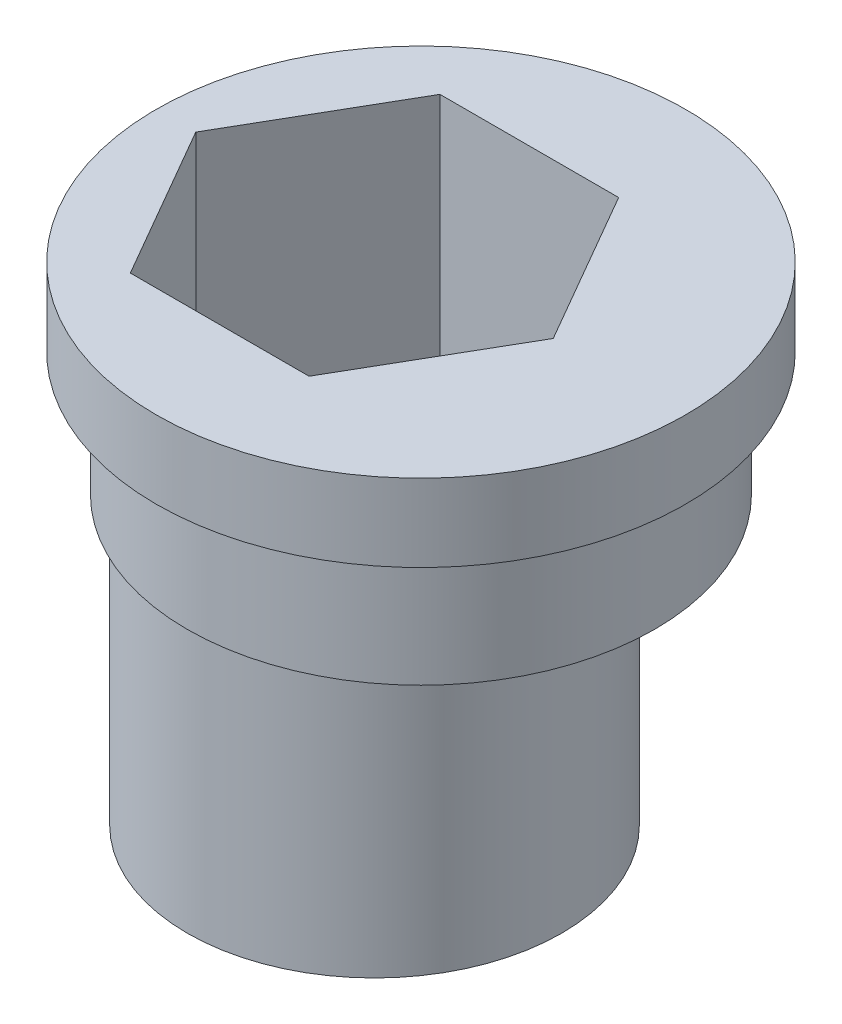
ISO-10303-21;
HEADER;
FILE_DESCRIPTION(('STEP AP214'),'2;1');
FILE_NAME('part.step','',(''),(''),'','','');
FILE_SCHEMA(('AUTOMOTIVE_DESIGN { 1 0 10303 214 1 1 1 1 }'));
ENDSEC;
DATA;
#1=APPLICATION_CONTEXT('core data for automotive mechanical design processes');
#2=APPLICATION_PROTOCOL_DEFINITION('international standard','automotive_design',2000,#1);
#3=PRODUCT_CONTEXT('',#1,'mechanical');
#4=PRODUCT('Part','Part','',(#3));
#5=PRODUCT_RELATED_PRODUCT_CATEGORY('part','',(#4));
#6=PRODUCT_DEFINITION_FORMATION('','',#4);
#7=PRODUCT_DEFINITION_CONTEXT('part definition',#1,'design');
#8=PRODUCT_DEFINITION('design','',#6,#7);
#9=PRODUCT_DEFINITION_SHAPE('','',#8);
#10=(LENGTH_UNIT() NAMED_UNIT(*) SI_UNIT(.MILLI.,.METRE.));
#11=(NAMED_UNIT(*) PLANE_ANGLE_UNIT() SI_UNIT($,.RADIAN.));
#12=(NAMED_UNIT(*) SI_UNIT($,.STERADIAN.) SOLID_ANGLE_UNIT());
#13=UNCERTAINTY_MEASURE_WITH_UNIT(LENGTH_MEASURE(1.E-05),#10,'distance_accuracy_value','');
#14=(GEOMETRIC_REPRESENTATION_CONTEXT(3) GLOBAL_UNCERTAINTY_ASSIGNED_CONTEXT((#13)) GLOBAL_UNIT_ASSIGNED_CONTEXT((#10,
#11,#12)) REPRESENTATION_CONTEXT('',''));
#15=CARTESIAN_POINT('',(0.,0.,0.));
#16=DIRECTION('',(0.,0.,1.));
#17=DIRECTION('',(1.,0.,0.));
#18=AXIS2_PLACEMENT_3D('',#15,#16,#17);
#19=CARTESIAN_POINT('',(4.33012701892219,-10.,-2.5));
#20=DIRECTION('',(0.866025403784438,0.,-0.5));
#21=DIRECTION('',(-0.5,0.,-0.866025403784439));
#22=AXIS2_PLACEMENT_3D('',#19,#20,#21);
#23=PLANE('',#22);
#24=DIRECTION('',(0.,1.,0.));
#25=VECTOR('',#24,1.);
#26=CARTESIAN_POINT('',(5.77350269189626,-10.,0.));
#27=LINE('',#26,#25);
#28=CARTESIAN_POINT('',(5.77350269189626,-10.,0.));
#29=VERTEX_POINT('',#28);
#30=CARTESIAN_POINT('',(5.77350269189626,6.5,0.));
#31=VERTEX_POINT('',#30);
#32=EDGE_CURVE('E63',#29,#31,#27,.T.);
#33=ORIENTED_EDGE('',*,*,#32,.T.);
#34=DIRECTION('',(0.5,0.,0.866025403784439));
#35=VECTOR('',#34,1.);
#36=CARTESIAN_POINT('',(4.3301270189222,6.5,-2.5));
#37=LINE('',#36,#35);
#38=CARTESIAN_POINT('',(2.88675134594813,6.5,-5.));
#39=VERTEX_POINT('',#38);
#40=EDGE_CURVE('E117',#39,#31,#37,.T.);
#41=ORIENTED_EDGE('',*,*,#40,.F.);
#42=DIRECTION('',(0.,1.,0.));
#43=VECTOR('',#42,1.);
#44=CARTESIAN_POINT('',(2.88675134594813,-10.,-5.));
#45=LINE('',#44,#43);
#46=CARTESIAN_POINT('',(2.88675134594813,-10.,-5.));
#47=VERTEX_POINT('',#46);
#48=EDGE_CURVE('E12',#47,#39,#45,.T.);
#49=ORIENTED_EDGE('',*,*,#48,.F.);
#50=DIRECTION('',(-0.5,0.,-0.866025403784439));
#51=VECTOR('',#50,1.);
#52=CARTESIAN_POINT('',(4.33012701892219,-10.,-2.5));
#53=LINE('',#52,#51);
#54=EDGE_CURVE('E119',#29,#47,#53,.T.);
#55=ORIENTED_EDGE('',*,*,#54,.F.);
#56=EDGE_LOOP('',(#33,#41,#49,#55));
#57=FACE_BOUND('',#56,.T.);
#58=ADVANCED_FACE('F60',(#57),#23,.F.);
#59=CARTESIAN_POINT('',(0.,-10.,-5.));
#60=DIRECTION('',(0.,0.,-1.));
#61=DIRECTION('',(-1.,0.,0.));
#62=AXIS2_PLACEMENT_3D('',#59,#60,#61);
#63=PLANE('',#62);
#64=ORIENTED_EDGE('',*,*,#48,.T.);
#65=DIRECTION('',(1.,0.,0.));
#66=VECTOR('',#65,1.);
#67=CARTESIAN_POINT('',(0.,6.5,-5.));
#68=LINE('',#67,#66);
#69=CARTESIAN_POINT('',(-2.88675134594813,6.5,-5.));
#70=VERTEX_POINT('',#69);
#71=EDGE_CURVE('E137',#70,#39,#68,.T.);
#72=ORIENTED_EDGE('',*,*,#71,.F.);
#73=DIRECTION('',(0.,1.,0.));
#74=VECTOR('',#73,1.);
#75=CARTESIAN_POINT('',(-2.88675134594813,-10.,-5.));
#76=LINE('',#75,#74);
#77=CARTESIAN_POINT('',(-2.88675134594813,-10.,-5.));
#78=VERTEX_POINT('',#77);
#79=EDGE_CURVE('E68',#78,#70,#76,.T.);
#80=ORIENTED_EDGE('',*,*,#79,.F.);
#81=DIRECTION('',(-1.,0.,0.));
#82=VECTOR('',#81,1.);
#83=CARTESIAN_POINT('',(0.,-10.,-5.));
#84=LINE('',#83,#82);
#85=EDGE_CURVE('E75',#47,#78,#84,.T.);
#86=ORIENTED_EDGE('',*,*,#85,.F.);
#87=EDGE_LOOP('',(#64,#72,#80,#86));
#88=FACE_BOUND('',#87,.T.);
#89=ADVANCED_FACE('F191',(#88),#63,.F.);
#90=CARTESIAN_POINT('',(-4.3301270189222,-10.,-2.5));
#91=DIRECTION('',(-0.866025403784439,0.,-0.5));
#92=DIRECTION('',(-0.5,0.,0.866025403784439));
#93=AXIS2_PLACEMENT_3D('',#90,#91,#92);
#94=PLANE('',#93);
#95=ORIENTED_EDGE('',*,*,#79,.T.);
#96=DIRECTION('',(0.5,0.,-0.866025403784439));
#97=VECTOR('',#96,1.);
#98=CARTESIAN_POINT('',(-4.3301270189222,6.5,-2.5));
#99=LINE('',#98,#97);
#100=CARTESIAN_POINT('',(-5.77350269189626,6.5,0.));
#101=VERTEX_POINT('',#100);
#102=EDGE_CURVE('E144',#101,#70,#99,.T.);
#103=ORIENTED_EDGE('',*,*,#102,.F.);
#104=DIRECTION('',(0.,1.,0.));
#105=VECTOR('',#104,1.);
#106=CARTESIAN_POINT('',(-5.77350269189626,-10.,0.));
#107=LINE('',#106,#105);
#108=CARTESIAN_POINT('',(-5.77350269189626,-10.,0.));
#109=VERTEX_POINT('',#108);
#110=EDGE_CURVE('E175',#109,#101,#107,.T.);
#111=ORIENTED_EDGE('',*,*,#110,.F.);
#112=DIRECTION('',(-0.5,0.,0.866025403784439));
#113=VECTOR('',#112,1.);
#114=CARTESIAN_POINT('',(-4.3301270189222,-10.,-2.5));
#115=LINE('',#114,#113);
#116=EDGE_CURVE('E167',#78,#109,#115,.T.);
#117=ORIENTED_EDGE('',*,*,#116,.F.);
#118=EDGE_LOOP('',(#95,#103,#111,#117));
#119=FACE_BOUND('',#118,.T.);
#120=ADVANCED_FACE('F189',(#119),#94,.F.);
#121=CARTESIAN_POINT('',(-4.33012701892219,-10.,2.5));
#122=DIRECTION('',(-0.866025403784438,0.,0.5));
#123=DIRECTION('',(0.5,0.,0.866025403784439));
#124=AXIS2_PLACEMENT_3D('',#121,#122,#123);
#125=PLANE('',#124);
#126=ORIENTED_EDGE('',*,*,#110,.T.);
#127=DIRECTION('',(-0.5,0.,-0.866025403784439));
#128=VECTOR('',#127,1.);
#129=CARTESIAN_POINT('',(-4.33012701892219,6.5,2.5));
#130=LINE('',#129,#128);
#131=CARTESIAN_POINT('',(-2.88675134594813,6.5,5.));
#132=VERTEX_POINT('',#131);
#133=EDGE_CURVE('E141',#132,#101,#130,.T.);
#134=ORIENTED_EDGE('',*,*,#133,.F.);
#135=DIRECTION('',(0.,1.,0.));
#136=VECTOR('',#135,1.);
#137=CARTESIAN_POINT('',(-2.88675134594813,-10.,5.));
#138=LINE('',#137,#136);
#139=CARTESIAN_POINT('',(-2.88675134594813,-10.,5.));
#140=VERTEX_POINT('',#139);
#141=EDGE_CURVE('E177',#140,#132,#138,.T.);
#142=ORIENTED_EDGE('',*,*,#141,.F.);
#143=DIRECTION('',(0.5,0.,0.866025403784439));
#144=VECTOR('',#143,1.);
#145=CARTESIAN_POINT('',(-4.33012701892219,-10.,2.5));
#146=LINE('',#145,#144);
#147=EDGE_CURVE('E165',#109,#140,#146,.T.);
#148=ORIENTED_EDGE('',*,*,#147,.F.);
#149=EDGE_LOOP('',(#126,#134,#142,#148));
#150=FACE_BOUND('',#149,.T.);
#151=ADVANCED_FACE('F185',(#150),#125,.F.);
#152=CARTESIAN_POINT('',(0.,-10.,5.));
#153=DIRECTION('',(0.,0.,1.));
#154=DIRECTION('',(1.,0.,0.));
#155=AXIS2_PLACEMENT_3D('',#152,#153,#154);
#156=PLANE('',#155);
#157=ORIENTED_EDGE('',*,*,#141,.T.);
#158=DIRECTION('',(-1.,0.,0.));
#159=VECTOR('',#158,1.);
#160=CARTESIAN_POINT('',(0.,6.5,5.));
#161=LINE('',#160,#159);
#162=CARTESIAN_POINT('',(2.88675134594813,6.5,5.));
#163=VERTEX_POINT('',#162);
#164=EDGE_CURVE('E131',#163,#132,#161,.T.);
#165=ORIENTED_EDGE('',*,*,#164,.F.);
#166=DIRECTION('',(0.,1.,0.));
#167=VECTOR('',#166,1.);
#168=CARTESIAN_POINT('',(2.88675134594813,-10.,5.));
#169=LINE('',#168,#167);
#170=CARTESIAN_POINT('',(2.88675134594813,-10.,5.));
#171=VERTEX_POINT('',#170);
#172=EDGE_CURVE('E122',#171,#163,#169,.T.);
#173=ORIENTED_EDGE('',*,*,#172,.F.);
#174=DIRECTION('',(1.,0.,0.));
#175=VECTOR('',#174,1.);
#176=CARTESIAN_POINT('',(0.,-10.,5.));
#177=LINE('',#176,#175);
#178=EDGE_CURVE('E163',#140,#171,#177,.T.);
#179=ORIENTED_EDGE('',*,*,#178,.F.);
#180=EDGE_LOOP('',(#157,#165,#173,#179));
#181=FACE_BOUND('',#180,.T.);
#182=ADVANCED_FACE('F182',(#181),#156,.F.);
#183=CARTESIAN_POINT('',(4.33012701892219,-10.,2.5));
#184=DIRECTION('',(0.866025403784438,0.,0.5));
#185=DIRECTION('',(0.5,0.,-0.866025403784438));
#186=AXIS2_PLACEMENT_3D('',#183,#184,#185);
#187=PLANE('',#186);
#188=ORIENTED_EDGE('',*,*,#172,.T.);
#189=DIRECTION('',(-0.5,0.,0.866025403784438));
#190=VECTOR('',#189,1.);
#191=CARTESIAN_POINT('',(4.33012701892219,6.5,2.5));
#192=LINE('',#191,#190);
#193=EDGE_CURVE('E125',#31,#163,#192,.T.);
#194=ORIENTED_EDGE('',*,*,#193,.F.);
#195=ORIENTED_EDGE('',*,*,#32,.F.);
#196=DIRECTION('',(0.5,0.,-0.866025403784438));
#197=VECTOR('',#196,1.);
#198=CARTESIAN_POINT('',(4.33012701892219,-10.,2.5));
#199=LINE('',#198,#197);
#200=EDGE_CURVE('E161',#171,#29,#199,.T.);
#201=ORIENTED_EDGE('',*,*,#200,.F.);
#202=EDGE_LOOP('',(#188,#194,#195,#201));
#203=FACE_BOUND('',#202,.T.);
#204=ADVANCED_FACE('F126',(#203),#187,.F.);
#205=CARTESIAN_POINT('',(0.,-10.,0.));
#206=DIRECTION('',(0.,1.,0.));
#207=DIRECTION('',(0.,0.,1.));
#208=AXIS2_PLACEMENT_3D('',#205,#206,#207);
#209=CYLINDRICAL_SURFACE('',#208,6.05);
#210=CARTESIAN_POINT('',(0.,-10.,0.));
#211=DIRECTION('',(0.,1.,0.));
#212=DIRECTION('',(0.,0.,1.));
#213=AXIS2_PLACEMENT_3D('',#210,#211,#212);
#214=CIRCLE('',#213,6.05);
#215=CARTESIAN_POINT('',(0.,-10.,6.05));
#216=VERTEX_POINT('',#215);
#217=EDGE_CURVE('E123',#216,#216,#214,.T.);
#218=ORIENTED_EDGE('',*,*,#217,.T.);
#219=EDGE_LOOP('',(#218));
#220=FACE_BOUND('',#219,.T.);
#221=CARTESIAN_POINT('',(0.,0.,0.));
#222=DIRECTION('',(0.,1.,0.));
#223=DIRECTION('',(0.,0.,1.));
#224=AXIS2_PLACEMENT_3D('',#221,#222,#223);
#225=CIRCLE('',#224,6.05);
#226=CARTESIAN_POINT('',(-6.05,0.,0.));
#227=VERTEX_POINT('',#226);
#228=EDGE_CURVE('E157',#227,#227,#225,.T.);
#229=ORIENTED_EDGE('',*,*,#228,.F.);
#230=EDGE_LOOP('',(#229));
#231=FACE_BOUND('',#230,.T.);
#232=ADVANCED_FACE('F200',(#220,#231),#209,.T.);
#233=CARTESIAN_POINT('',(0.,-10.,0.));
#234=DIRECTION('',(0.,1.,0.));
#235=DIRECTION('',(0.,0.,1.));
#236=AXIS2_PLACEMENT_3D('',#233,#234,#235);
#237=PLANE('',#236);
#238=ORIENTED_EDGE('',*,*,#54,.T.);
#239=ORIENTED_EDGE('',*,*,#85,.T.);
#240=ORIENTED_EDGE('',*,*,#116,.T.);
#241=ORIENTED_EDGE('',*,*,#147,.T.);
#242=ORIENTED_EDGE('',*,*,#178,.T.);
#243=ORIENTED_EDGE('',*,*,#200,.T.);
#244=EDGE_LOOP('',(#238,#239,#240,#241,#242,#243));
#245=FACE_BOUND('',#244,.T.);
#246=ORIENTED_EDGE('',*,*,#217,.F.);
#247=EDGE_LOOP('',(#246));
#248=FACE_BOUND('',#247,.T.);
#249=ADVANCED_FACE('F211',(#245,#248),#237,.F.);
#250=CARTESIAN_POINT('',(1.5,4.,0.));
#251=DIRECTION('',(0.,-1.,0.));
#252=DIRECTION('',(0.,0.,-1.));
#253=AXIS2_PLACEMENT_3D('',#250,#251,#252);
#254=CYLINDRICAL_SURFACE('',#253,7.55);
#255=CARTESIAN_POINT('',(1.5,4.,0.));
#256=DIRECTION('',(0.,1.,0.));
#257=DIRECTION('',(0.,0.,1.));
#258=AXIS2_PLACEMENT_3D('',#255,#256,#257);
#259=CIRCLE('',#258,7.55);
#260=CARTESIAN_POINT('',(1.5,4.,7.55));
#261=VERTEX_POINT('',#260);
#262=EDGE_CURVE('E154',#261,#261,#259,.T.);
#263=ORIENTED_EDGE('',*,*,#262,.F.);
#264=EDGE_LOOP('',(#263));
#265=FACE_BOUND('',#264,.T.);
#266=CARTESIAN_POINT('',(1.5,0.,0.));
#267=DIRECTION('',(0.,1.,0.));
#268=DIRECTION('',(0.,0.,1.));
#269=AXIS2_PLACEMENT_3D('',#266,#267,#268);
#270=CIRCLE('',#269,7.55);
#271=EDGE_CURVE('E151',#227,#227,#270,.T.);
#272=ORIENTED_EDGE('',*,*,#271,.T.);
#273=EDGE_LOOP('',(#272));
#274=FACE_BOUND('',#273,.T.);
#275=ADVANCED_FACE('F217',(#265,#274),#254,.T.);
#276=CARTESIAN_POINT('',(0.,0.,0.));
#277=DIRECTION('',(0.,1.,0.));
#278=DIRECTION('',(0.,0.,1.));
#279=AXIS2_PLACEMENT_3D('',#276,#277,#278);
#280=PLANE('',#279);
#281=ORIENTED_EDGE('',*,*,#271,.F.);
#282=ORIENTED_EDGE('',*,*,#228,.T.);
#283=EDGE_LOOP('',(#281,#282));
#284=FACE_BOUND('',#283,.T.);
#285=ADVANCED_FACE('F222',(#284),#280,.F.);
#286=CARTESIAN_POINT('',(1.5,6.5,0.));
#287=DIRECTION('',(0.,-1.,0.));
#288=DIRECTION('',(0.,0.,-1.));
#289=AXIS2_PLACEMENT_3D('',#286,#287,#288);
#290=CYLINDRICAL_SURFACE('',#289,8.55000000000001);
#291=CARTESIAN_POINT('',(1.5,6.5,0.));
#292=DIRECTION('',(0.,1.,0.));
#293=DIRECTION('',(0.,0.,1.));
#294=AXIS2_PLACEMENT_3D('',#291,#292,#293);
#295=CIRCLE('',#294,8.55000000000001);
#296=CARTESIAN_POINT('',(1.5,6.5,8.55000000000001));
#297=VERTEX_POINT('',#296);
#298=EDGE_CURVE('E148',#297,#297,#295,.T.);
#299=ORIENTED_EDGE('',*,*,#298,.F.);
#300=EDGE_LOOP('',(#299));
#301=FACE_BOUND('',#300,.T.);
#302=CARTESIAN_POINT('',(1.5,4.,0.));
#303=DIRECTION('',(0.,1.,0.));
#304=DIRECTION('',(0.,0.,1.));
#305=AXIS2_PLACEMENT_3D('',#302,#303,#304);
#306=CIRCLE('',#305,8.55000000000001);
#307=CARTESIAN_POINT('',(1.5,4.,8.55000000000001));
#308=VERTEX_POINT('',#307);
#309=EDGE_CURVE('E147',#308,#308,#306,.T.);
#310=ORIENTED_EDGE('',*,*,#309,.T.);
#311=EDGE_LOOP('',(#310));
#312=FACE_BOUND('',#311,.T.);
#313=ADVANCED_FACE('F229',(#301,#312),#290,.T.);
#314=CARTESIAN_POINT('',(1.5,6.5,0.));
#315=DIRECTION('',(0.,1.,0.));
#316=DIRECTION('',(0.,0.,1.));
#317=AXIS2_PLACEMENT_3D('',#314,#315,#316);
#318=PLANE('',#317);
#319=ORIENTED_EDGE('',*,*,#40,.T.);
#320=ORIENTED_EDGE('',*,*,#193,.T.);
#321=ORIENTED_EDGE('',*,*,#164,.T.);
#322=ORIENTED_EDGE('',*,*,#133,.T.);
#323=ORIENTED_EDGE('',*,*,#102,.T.);
#324=ORIENTED_EDGE('',*,*,#71,.T.);
#325=EDGE_LOOP('',(#319,#320,#321,#322,#323,#324));
#326=FACE_BOUND('',#325,.T.);
#327=ORIENTED_EDGE('',*,*,#298,.T.);
#328=EDGE_LOOP('',(#327));
#329=FACE_BOUND('',#328,.T.);
#330=ADVANCED_FACE('F133',(#326,#329),#318,.T.);
#331=CARTESIAN_POINT('',(1.5,4.,0.));
#332=DIRECTION('',(0.,1.,0.));
#333=DIRECTION('',(0.,0.,1.));
#334=AXIS2_PLACEMENT_3D('',#331,#332,#333);
#335=PLANE('',#334);
#336=ORIENTED_EDGE('',*,*,#262,.T.);
#337=EDGE_LOOP('',(#336));
#338=FACE_BOUND('',#337,.T.);
#339=ORIENTED_EDGE('',*,*,#309,.F.);
#340=EDGE_LOOP('',(#339));
#341=FACE_BOUND('',#340,.T.);
#342=ADVANCED_FACE('F235',(#338,#341),#335,.F.);
#343=CLOSED_SHELL('',(#58,#89,#120,#151,#182,#204,#232,#249,#275,#285,#313,#330,#342));
#344=MANIFOLD_SOLID_BREP('B2',#343);
#345=ADVANCED_BREP_SHAPE_REPRESENTATION('',(#18,#344),#14);
#346=SHAPE_DEFINITION_REPRESENTATION(#9,#345);
ENDSEC;
END-ISO-10303-21;
